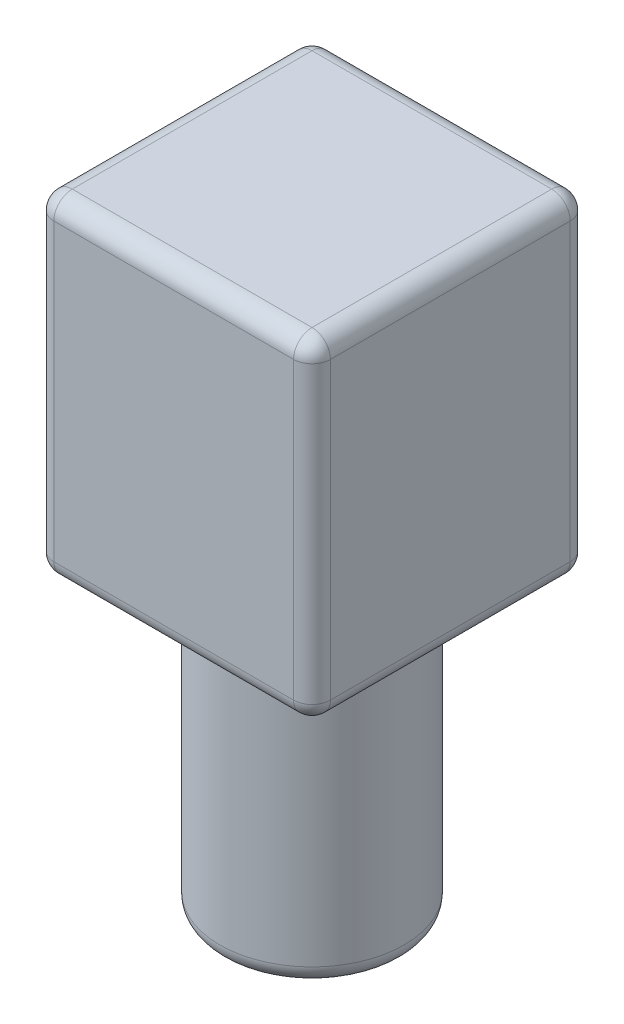
ISO-10303-21;
HEADER;
FILE_DESCRIPTION(('STEP AP214'),'2;1');
FILE_NAME('part.step','',(''),(''),'','','');
FILE_SCHEMA(('AUTOMOTIVE_DESIGN { 1 0 10303 214 1 1 1 1 }'));
ENDSEC;
DATA;
#1=APPLICATION_CONTEXT('core data for automotive mechanical design processes');
#2=APPLICATION_PROTOCOL_DEFINITION('international standard','automotive_design',2000,#1);
#3=PRODUCT_CONTEXT('',#1,'mechanical');
#4=PRODUCT('Part','Part','',(#3));
#5=PRODUCT_RELATED_PRODUCT_CATEGORY('part','',(#4));
#6=PRODUCT_DEFINITION_FORMATION('','',#4);
#7=PRODUCT_DEFINITION_CONTEXT('part definition',#1,'design');
#8=PRODUCT_DEFINITION('design','',#6,#7);
#9=PRODUCT_DEFINITION_SHAPE('','',#8);
#10=(LENGTH_UNIT() NAMED_UNIT(*) SI_UNIT(.MILLI.,.METRE.));
#11=(NAMED_UNIT(*) PLANE_ANGLE_UNIT() SI_UNIT($,.RADIAN.));
#12=(NAMED_UNIT(*) SI_UNIT($,.STERADIAN.) SOLID_ANGLE_UNIT());
#13=UNCERTAINTY_MEASURE_WITH_UNIT(LENGTH_MEASURE(1.E-05),#10,'distance_accuracy_value','');
#14=(GEOMETRIC_REPRESENTATION_CONTEXT(3) GLOBAL_UNCERTAINTY_ASSIGNED_CONTEXT((#13)) GLOBAL_UNIT_ASSIGNED_CONTEXT((#10,
#11,#12)) REPRESENTATION_CONTEXT('',''));
#15=CARTESIAN_POINT('',(0.,0.,0.));
#16=DIRECTION('',(0.,0.,1.));
#17=DIRECTION('',(1.,0.,0.));
#18=AXIS2_PLACEMENT_3D('',#15,#16,#17);
#19=CARTESIAN_POINT('',(0.,32.,0.));
#20=DIRECTION('',(0.,-1.,0.));
#21=DIRECTION('',(0.,0.,-1.));
#22=AXIS2_PLACEMENT_3D('',#19,#20,#21);
#23=CYLINDRICAL_SURFACE('',#22,10.);
#24=CARTESIAN_POINT('',(0.,2.,0.));
#25=DIRECTION('',(0.,1.,0.));
#26=DIRECTION('',(0.,0.,1.));
#27=AXIS2_PLACEMENT_3D('',#24,#25,#26);
#28=CIRCLE('',#27,10.);
#29=CARTESIAN_POINT('',(0.,2.,10.));
#30=VERTEX_POINT('',#29);
#31=EDGE_CURVE('E170',#30,#30,#28,.T.);
#32=ORIENTED_EDGE('',*,*,#31,.T.);
#33=EDGE_LOOP('',(#32));
#34=FACE_BOUND('',#33,.T.);
#35=CARTESIAN_POINT('',(0.,32.,0.));
#36=DIRECTION('',(0.,1.,0.));
#37=DIRECTION('',(0.,0.,1.));
#38=AXIS2_PLACEMENT_3D('',#35,#36,#37);
#39=CIRCLE('',#38,10.);
#40=CARTESIAN_POINT('',(0.,32.,10.));
#41=VERTEX_POINT('',#40);
#42=EDGE_CURVE('E267',#41,#41,#39,.T.);
#43=ORIENTED_EDGE('',*,*,#42,.F.);
#44=EDGE_LOOP('',(#43));
#45=FACE_BOUND('',#44,.T.);
#46=ADVANCED_FACE('F40',(#34,#45),#23,.T.);
#47=CARTESIAN_POINT('',(0.,0.,0.));
#48=DIRECTION('',(0.,1.,0.));
#49=DIRECTION('',(0.,0.,1.));
#50=AXIS2_PLACEMENT_3D('',#47,#48,#49);
#51=PLANE('',#50);
#52=CARTESIAN_POINT('',(0.,0.,0.));
#53=DIRECTION('',(0.,1.,0.));
#54=DIRECTION('',(0.,0.,1.));
#55=AXIS2_PLACEMENT_3D('',#52,#53,#54);
#56=CIRCLE('',#55,8.);
#57=CARTESIAN_POINT('',(0.,0.,8.));
#58=VERTEX_POINT('',#57);
#59=EDGE_CURVE('E167',#58,#58,#56,.F.);
#60=ORIENTED_EDGE('',*,*,#59,.T.);
#61=EDGE_LOOP('',(#60));
#62=FACE_BOUND('',#61,.T.);
#63=ADVANCED_FACE('F296',(#62),#51,.F.);
#64=CARTESIAN_POINT('',(-15.,68.,15.));
#65=DIRECTION('',(-1.,0.,0.));
#66=DIRECTION('',(0.,0.,1.));
#67=AXIS2_PLACEMENT_3D('',#64,#65,#66);
#68=PLANE('',#67);
#69=DIRECTION('',(0.,0.,-1.));
#70=VECTOR('',#69,1.);
#71=CARTESIAN_POINT('',(-15.,66.,-15.));
#72=LINE('',#71,#70);
#73=CARTESIAN_POINT('',(-15.,66.,13.));
#74=VERTEX_POINT('',#73);
#75=CARTESIAN_POINT('',(-15.,66.,-13.));
#76=VERTEX_POINT('',#75);
#77=EDGE_CURVE('E179',#74,#76,#72,.T.);
#78=ORIENTED_EDGE('',*,*,#77,.T.);
#79=DIRECTION('',(0.,-1.,0.));
#80=VECTOR('',#79,1.);
#81=CARTESIAN_POINT('',(-15.,68.,-13.));
#82=LINE('',#81,#80);
#83=CARTESIAN_POINT('',(-15.,34.,-13.));
#84=VERTEX_POINT('',#83);
#85=EDGE_CURVE('E184',#76,#84,#82,.T.);
#86=ORIENTED_EDGE('',*,*,#85,.T.);
#87=DIRECTION('',(0.,0.,-1.));
#88=VECTOR('',#87,1.);
#89=CARTESIAN_POINT('',(-15.,34.,15.));
#90=LINE('',#89,#88);
#91=CARTESIAN_POINT('',(-15.,34.,13.));
#92=VERTEX_POINT('',#91);
#93=EDGE_CURVE('E181',#84,#92,#90,.F.);
#94=ORIENTED_EDGE('',*,*,#93,.T.);
#95=DIRECTION('',(0.,-1.,0.));
#96=VECTOR('',#95,1.);
#97=CARTESIAN_POINT('',(-15.,68.,13.));
#98=LINE('',#97,#96);
#99=EDGE_CURVE('E177',#92,#74,#98,.F.);
#100=ORIENTED_EDGE('',*,*,#99,.T.);
#101=EDGE_LOOP('',(#78,#86,#94,#100));
#102=FACE_BOUND('',#101,.T.);
#103=ADVANCED_FACE('F300',(#102),#68,.T.);
#104=CARTESIAN_POINT('',(-15.,68.,15.));
#105=DIRECTION('',(0.,0.,-1.));
#106=DIRECTION('',(-1.,0.,0.));
#107=AXIS2_PLACEMENT_3D('',#104,#105,#106);
#108=PLANE('',#107);
#109=DIRECTION('',(1.,0.,0.));
#110=VECTOR('',#109,1.);
#111=CARTESIAN_POINT('',(15.,34.,15.));
#112=LINE('',#111,#110);
#113=CARTESIAN_POINT('',(-13.,34.,15.));
#114=VERTEX_POINT('',#113);
#115=CARTESIAN_POINT('',(13.,34.,15.));
#116=VERTEX_POINT('',#115);
#117=EDGE_CURVE('E206',#114,#116,#112,.T.);
#118=ORIENTED_EDGE('',*,*,#117,.T.);
#119=DIRECTION('',(0.,-1.,0.));
#120=VECTOR('',#119,1.);
#121=CARTESIAN_POINT('',(13.,68.,15.));
#122=LINE('',#121,#120);
#123=CARTESIAN_POINT('',(13.,66.,15.));
#124=VERTEX_POINT('',#123);
#125=EDGE_CURVE('E209',#116,#124,#122,.F.);
#126=ORIENTED_EDGE('',*,*,#125,.T.);
#127=DIRECTION('',(1.,0.,0.));
#128=VECTOR('',#127,1.);
#129=CARTESIAN_POINT('',(-15.,66.,15.));
#130=LINE('',#129,#128);
#131=CARTESIAN_POINT('',(-13.,66.,15.));
#132=VERTEX_POINT('',#131);
#133=EDGE_CURVE('E204',#124,#132,#130,.F.);
#134=ORIENTED_EDGE('',*,*,#133,.T.);
#135=DIRECTION('',(0.,-1.,0.));
#136=VECTOR('',#135,1.);
#137=CARTESIAN_POINT('',(-13.,32.,15.));
#138=LINE('',#137,#136);
#139=EDGE_CURVE('E202',#132,#114,#138,.T.);
#140=ORIENTED_EDGE('',*,*,#139,.T.);
#141=EDGE_LOOP('',(#118,#126,#134,#140));
#142=FACE_BOUND('',#141,.T.);
#143=ADVANCED_FACE('F306',(#142),#108,.F.);
#144=CARTESIAN_POINT('',(15.,68.,15.));
#145=DIRECTION('',(-1.,0.,0.));
#146=DIRECTION('',(0.,0.,1.));
#147=AXIS2_PLACEMENT_3D('',#144,#145,#146);
#148=PLANE('',#147);
#149=DIRECTION('',(0.,0.,-1.));
#150=VECTOR('',#149,1.);
#151=CARTESIAN_POINT('',(15.,34.,-15.));
#152=LINE('',#151,#150);
#153=CARTESIAN_POINT('',(15.,34.,13.));
#154=VERTEX_POINT('',#153);
#155=CARTESIAN_POINT('',(15.,34.,-13.));
#156=VERTEX_POINT('',#155);
#157=EDGE_CURVE('E148',#154,#156,#152,.T.);
#158=ORIENTED_EDGE('',*,*,#157,.T.);
#159=DIRECTION('',(0.,-1.,0.));
#160=VECTOR('',#159,1.);
#161=CARTESIAN_POINT('',(15.,68.,-13.));
#162=LINE('',#161,#160);
#163=CARTESIAN_POINT('',(15.,66.,-13.));
#164=VERTEX_POINT('',#163);
#165=EDGE_CURVE('E200',#156,#164,#162,.F.);
#166=ORIENTED_EDGE('',*,*,#165,.T.);
#167=DIRECTION('',(0.,0.,-1.));
#168=VECTOR('',#167,1.);
#169=CARTESIAN_POINT('',(15.,66.,15.));
#170=LINE('',#169,#168);
#171=CARTESIAN_POINT('',(15.,66.,13.));
#172=VERTEX_POINT('',#171);
#173=EDGE_CURVE('E197',#164,#172,#170,.F.);
#174=ORIENTED_EDGE('',*,*,#173,.T.);
#175=DIRECTION('',(0.,-1.,0.));
#176=VECTOR('',#175,1.);
#177=CARTESIAN_POINT('',(15.,68.,13.));
#178=LINE('',#177,#176);
#179=EDGE_CURVE('E195',#172,#154,#178,.T.);
#180=ORIENTED_EDGE('',*,*,#179,.T.);
#181=EDGE_LOOP('',(#158,#166,#174,#180));
#182=FACE_BOUND('',#181,.T.);
#183=ADVANCED_FACE('F311',(#182),#148,.F.);
#184=CARTESIAN_POINT('',(-15.,68.,-15.));
#185=DIRECTION('',(0.,0.,-1.));
#186=DIRECTION('',(-1.,0.,0.));
#187=AXIS2_PLACEMENT_3D('',#184,#185,#186);
#188=PLANE('',#187);
#189=DIRECTION('',(1.,0.,0.));
#190=VECTOR('',#189,1.);
#191=CARTESIAN_POINT('',(-15.,34.,-15.));
#192=LINE('',#191,#190);
#193=CARTESIAN_POINT('',(13.,34.,-15.));
#194=VERTEX_POINT('',#193);
#195=CARTESIAN_POINT('',(-13.,34.,-15.));
#196=VERTEX_POINT('',#195);
#197=EDGE_CURVE('E190',#194,#196,#192,.F.);
#198=ORIENTED_EDGE('',*,*,#197,.T.);
#199=DIRECTION('',(0.,-1.,0.));
#200=VECTOR('',#199,1.);
#201=CARTESIAN_POINT('',(-13.,68.,-15.));
#202=LINE('',#201,#200);
#203=CARTESIAN_POINT('',(-13.,66.,-15.));
#204=VERTEX_POINT('',#203);
#205=EDGE_CURVE('E193',#196,#204,#202,.F.);
#206=ORIENTED_EDGE('',*,*,#205,.T.);
#207=DIRECTION('',(1.,0.,0.));
#208=VECTOR('',#207,1.);
#209=CARTESIAN_POINT('',(15.,66.,-15.));
#210=LINE('',#209,#208);
#211=CARTESIAN_POINT('',(13.,66.,-15.));
#212=VERTEX_POINT('',#211);
#213=EDGE_CURVE('E188',#204,#212,#210,.T.);
#214=ORIENTED_EDGE('',*,*,#213,.T.);
#215=DIRECTION('',(0.,-1.,0.));
#216=VECTOR('',#215,1.);
#217=CARTESIAN_POINT('',(13.,32.,-15.));
#218=LINE('',#217,#216);
#219=EDGE_CURVE('E186',#212,#194,#218,.T.);
#220=ORIENTED_EDGE('',*,*,#219,.T.);
#221=EDGE_LOOP('',(#198,#206,#214,#220));
#222=FACE_BOUND('',#221,.T.);
#223=ADVANCED_FACE('F308',(#222),#188,.T.);
#224=CARTESIAN_POINT('',(0.,68.,0.));
#225=DIRECTION('',(0.,-1.,0.));
#226=DIRECTION('',(0.,0.,-1.));
#227=AXIS2_PLACEMENT_3D('',#224,#225,#226);
#228=PLANE('',#227);
#229=DIRECTION('',(1.,0.,0.));
#230=VECTOR('',#229,1.);
#231=CARTESIAN_POINT('',(-15.,68.,-13.));
#232=LINE('',#231,#230);
#233=CARTESIAN_POINT('',(13.,68.,-13.));
#234=VERTEX_POINT('',#233);
#235=CARTESIAN_POINT('',(-13.,68.,-13.));
#236=VERTEX_POINT('',#235);
#237=EDGE_CURVE('E49',#234,#236,#232,.F.);
#238=ORIENTED_EDGE('',*,*,#237,.T.);
#239=DIRECTION('',(0.,0.,-1.));
#240=VECTOR('',#239,1.);
#241=CARTESIAN_POINT('',(-13.,68.,15.));
#242=LINE('',#241,#240);
#243=CARTESIAN_POINT('',(-13.,68.,13.));
#244=VERTEX_POINT('',#243);
#245=EDGE_CURVE('E11',#236,#244,#242,.F.);
#246=ORIENTED_EDGE('',*,*,#245,.T.);
#247=DIRECTION('',(1.,0.,0.));
#248=VECTOR('',#247,1.);
#249=CARTESIAN_POINT('',(0.,68.,13.));
#250=LINE('',#249,#248);
#251=CARTESIAN_POINT('',(13.,68.,13.));
#252=VERTEX_POINT('',#251);
#253=EDGE_CURVE('E211',#244,#252,#250,.T.);
#254=ORIENTED_EDGE('',*,*,#253,.T.);
#255=DIRECTION('',(0.,0.,-1.));
#256=VECTOR('',#255,1.);
#257=CARTESIAN_POINT('',(13.,68.,0.));
#258=LINE('',#257,#256);
#259=EDGE_CURVE('E60',#252,#234,#258,.T.);
#260=ORIENTED_EDGE('',*,*,#259,.T.);
#261=EDGE_LOOP('',(#238,#246,#254,#260));
#262=FACE_BOUND('',#261,.T.);
#263=ADVANCED_FACE('F290',(#262),#228,.F.);
#264=CARTESIAN_POINT('',(0.,32.,0.));
#265=DIRECTION('',(0.,-1.,0.));
#266=DIRECTION('',(0.,0.,-1.));
#267=AXIS2_PLACEMENT_3D('',#264,#265,#266);
#268=PLANE('',#267);
#269=DIRECTION('',(1.,0.,0.));
#270=VECTOR('',#269,1.);
#271=CARTESIAN_POINT('',(-15.,32.,13.));
#272=LINE('',#271,#270);
#273=CARTESIAN_POINT('',(13.,32.,13.));
#274=VERTEX_POINT('',#273);
#275=CARTESIAN_POINT('',(-13.,32.,13.));
#276=VERTEX_POINT('',#275);
#277=EDGE_CURVE('E134',#274,#276,#272,.F.);
#278=ORIENTED_EDGE('',*,*,#277,.T.);
#279=DIRECTION('',(0.,0.,-1.));
#280=VECTOR('',#279,1.);
#281=CARTESIAN_POINT('',(-13.,32.,0.));
#282=LINE('',#281,#280);
#283=CARTESIAN_POINT('',(-13.,32.,-13.));
#284=VERTEX_POINT('',#283);
#285=EDGE_CURVE('E175',#276,#284,#282,.T.);
#286=ORIENTED_EDGE('',*,*,#285,.T.);
#287=DIRECTION('',(1.,0.,0.));
#288=VECTOR('',#287,1.);
#289=CARTESIAN_POINT('',(0.,32.,-13.));
#290=LINE('',#289,#288);
#291=CARTESIAN_POINT('',(13.,32.,-13.));
#292=VERTEX_POINT('',#291);
#293=EDGE_CURVE('E137',#284,#292,#290,.T.);
#294=ORIENTED_EDGE('',*,*,#293,.T.);
#295=DIRECTION('',(0.,0.,-1.));
#296=VECTOR('',#295,1.);
#297=CARTESIAN_POINT('',(13.,32.,15.));
#298=LINE('',#297,#296);
#299=EDGE_CURVE('E128',#292,#274,#298,.F.);
#300=ORIENTED_EDGE('',*,*,#299,.T.);
#301=EDGE_LOOP('',(#278,#286,#294,#300));
#302=FACE_BOUND('',#301,.T.);
#303=ORIENTED_EDGE('',*,*,#42,.T.);
#304=EDGE_LOOP('',(#303));
#305=FACE_BOUND('',#304,.T.);
#306=ADVANCED_FACE('F130',(#302,#305),#268,.T.);
#307=CARTESIAN_POINT('',(0.,2.,0.));
#308=DIRECTION('',(0.,1.,0.));
#309=DIRECTION('',(0.,0.,1.));
#310=AXIS2_PLACEMENT_3D('',#307,#308,#309);
#311=TOROIDAL_SURFACE('',#310,8.,2.);
#312=ORIENTED_EDGE('',*,*,#59,.F.);
#313=EDGE_LOOP('',(#312));
#314=FACE_BOUND('',#313,.T.);
#315=ORIENTED_EDGE('',*,*,#31,.F.);
#316=EDGE_LOOP('',(#315));
#317=FACE_BOUND('',#316,.T.);
#318=ADVANCED_FACE('F280',(#314,#317),#311,.T.);
#319=CARTESIAN_POINT('',(13.,66.,0.));
#320=DIRECTION('',(0.,0.,-1.));
#321=DIRECTION('',(-1.,0.,0.));
#322=AXIS2_PLACEMENT_3D('',#319,#320,#321);
#323=CYLINDRICAL_SURFACE('',#322,2.);
#324=CARTESIAN_POINT('',(13.,66.,13.));
#325=DIRECTION('',(0.,0.,1.));
#326=DIRECTION('',(1.,0.,0.));
#327=AXIS2_PLACEMENT_3D('',#324,#325,#326);
#328=CIRCLE('',#327,2.);
#329=EDGE_CURVE('E44',#172,#252,#328,.T.);
#330=ORIENTED_EDGE('',*,*,#329,.F.);
#331=ORIENTED_EDGE('',*,*,#173,.F.);
#332=CARTESIAN_POINT('',(13.,66.,-13.));
#333=DIRECTION('',(0.,0.,-1.));
#334=DIRECTION('',(-1.,0.,0.));
#335=AXIS2_PLACEMENT_3D('',#332,#333,#334);
#336=CIRCLE('',#335,2.);
#337=EDGE_CURVE('E261',#234,#164,#336,.T.);
#338=ORIENTED_EDGE('',*,*,#337,.F.);
#339=ORIENTED_EDGE('',*,*,#259,.F.);
#340=EDGE_LOOP('',(#330,#331,#338,#339));
#341=FACE_BOUND('',#340,.T.);
#342=ADVANCED_FACE('F42',(#341),#323,.T.);
#343=CARTESIAN_POINT('',(13.,66.,13.));
#344=DIRECTION('',(0.,1.,0.));
#345=DIRECTION('',(0.,0.,1.));
#346=AXIS2_PLACEMENT_3D('',#343,#344,#345);
#347=SPHERICAL_SURFACE('',#346,2.);
#348=CARTESIAN_POINT('',(13.,66.,13.));
#349=DIRECTION('',(0.,1.,0.));
#350=DIRECTION('',(0.,0.,1.));
#351=AXIS2_PLACEMENT_3D('',#348,#349,#350);
#352=CIRCLE('',#351,2.);
#353=EDGE_CURVE('E256',#172,#124,#352,.F.);
#354=ORIENTED_EDGE('',*,*,#353,.F.);
#355=ORIENTED_EDGE('',*,*,#329,.T.);
#356=CARTESIAN_POINT('',(13.,66.,13.));
#357=DIRECTION('',(1.,0.,0.));
#358=DIRECTION('',(0.,0.,-1.));
#359=AXIS2_PLACEMENT_3D('',#356,#357,#358);
#360=CIRCLE('',#359,2.);
#361=EDGE_CURVE('E259',#124,#252,#360,.F.);
#362=ORIENTED_EDGE('',*,*,#361,.F.);
#363=EDGE_LOOP('',(#354,#355,#362));
#364=FACE_BOUND('',#363,.T.);
#365=ADVANCED_FACE('F288',(#364),#347,.T.);
#366=CARTESIAN_POINT('',(13.,66.,-13.));
#367=DIRECTION('',(1.,0.,0.));
#368=DIRECTION('',(0.,0.,-1.));
#369=AXIS2_PLACEMENT_3D('',#366,#367,#368);
#370=SPHERICAL_SURFACE('',#369,2.);
#371=CARTESIAN_POINT('',(13.,66.,-13.));
#372=DIRECTION('',(1.,0.,0.));
#373=DIRECTION('',(0.,1.,0.));
#374=AXIS2_PLACEMENT_3D('',#371,#372,#373);
#375=CIRCLE('',#374,2.);
#376=EDGE_CURVE('E250',#234,#212,#375,.F.);
#377=ORIENTED_EDGE('',*,*,#376,.F.);
#378=ORIENTED_EDGE('',*,*,#337,.T.);
#379=CARTESIAN_POINT('',(13.,66.,-13.));
#380=DIRECTION('',(0.,1.,0.));
#381=DIRECTION('',(0.,0.,1.));
#382=AXIS2_PLACEMENT_3D('',#379,#380,#381);
#383=CIRCLE('',#382,2.);
#384=EDGE_CURVE('E253',#212,#164,#383,.F.);
#385=ORIENTED_EDGE('',*,*,#384,.F.);
#386=EDGE_LOOP('',(#377,#378,#385));
#387=FACE_BOUND('',#386,.T.);
#388=ADVANCED_FACE('F349',(#387),#370,.T.);
#389=CARTESIAN_POINT('',(0.,66.,13.));
#390=DIRECTION('',(1.,0.,0.));
#391=DIRECTION('',(0.,0.,-1.));
#392=AXIS2_PLACEMENT_3D('',#389,#390,#391);
#393=CYLINDRICAL_SURFACE('',#392,2.);
#394=ORIENTED_EDGE('',*,*,#361,.T.);
#395=ORIENTED_EDGE('',*,*,#253,.F.);
#396=CARTESIAN_POINT('',(-13.,66.,13.));
#397=DIRECTION('',(-1.,0.,0.));
#398=DIRECTION('',(0.,0.,1.));
#399=AXIS2_PLACEMENT_3D('',#396,#397,#398);
#400=CIRCLE('',#399,2.);
#401=EDGE_CURVE('E245',#132,#244,#400,.T.);
#402=ORIENTED_EDGE('',*,*,#401,.F.);
#403=ORIENTED_EDGE('',*,*,#133,.F.);
#404=EDGE_LOOP('',(#394,#395,#402,#403));
#405=FACE_BOUND('',#404,.T.);
#406=ADVANCED_FACE('F357',(#405),#393,.T.);
#407=CARTESIAN_POINT('',(13.,68.,13.));
#408=DIRECTION('',(0.,-1.,0.));
#409=DIRECTION('',(0.,0.,-1.));
#410=AXIS2_PLACEMENT_3D('',#407,#408,#409);
#411=CYLINDRICAL_SURFACE('',#410,2.);
#412=ORIENTED_EDGE('',*,*,#353,.T.);
#413=ORIENTED_EDGE('',*,*,#125,.F.);
#414=CARTESIAN_POINT('',(13.,34.,13.));
#415=DIRECTION('',(0.,-1.,0.));
#416=DIRECTION('',(0.,0.,-1.));
#417=AXIS2_PLACEMENT_3D('',#414,#415,#416);
#418=CIRCLE('',#417,2.);
#419=EDGE_CURVE('E152',#154,#116,#418,.T.);
#420=ORIENTED_EDGE('',*,*,#419,.F.);
#421=ORIENTED_EDGE('',*,*,#179,.F.);
#422=EDGE_LOOP('',(#412,#413,#420,#421));
#423=FACE_BOUND('',#422,.T.);
#424=ADVANCED_FACE('F366',(#423),#411,.T.);
#425=CARTESIAN_POINT('',(13.,34.,15.));
#426=DIRECTION('',(0.,0.,1.));
#427=DIRECTION('',(1.,0.,0.));
#428=AXIS2_PLACEMENT_3D('',#425,#426,#427);
#429=CYLINDRICAL_SURFACE('',#428,2.);
#430=CARTESIAN_POINT('',(13.,34.,-13.));
#431=DIRECTION('',(0.,0.,-1.));
#432=DIRECTION('',(-1.,0.,0.));
#433=AXIS2_PLACEMENT_3D('',#430,#431,#432);
#434=CIRCLE('',#433,2.);
#435=EDGE_CURVE('E153',#156,#292,#434,.T.);
#436=ORIENTED_EDGE('',*,*,#435,.F.);
#437=ORIENTED_EDGE('',*,*,#157,.F.);
#438=CARTESIAN_POINT('',(13.,34.,13.));
#439=DIRECTION('',(0.,0.,1.));
#440=DIRECTION('',(1.,0.,0.));
#441=AXIS2_PLACEMENT_3D('',#438,#439,#440);
#442=CIRCLE('',#441,2.);
#443=EDGE_CURVE('E144',#274,#154,#442,.T.);
#444=ORIENTED_EDGE('',*,*,#443,.F.);
#445=ORIENTED_EDGE('',*,*,#299,.F.);
#446=EDGE_LOOP('',(#436,#437,#444,#445));
#447=FACE_BOUND('',#446,.T.);
#448=ADVANCED_FACE('F146',(#447),#429,.T.);
#449=CARTESIAN_POINT('',(13.,68.,-13.));
#450=DIRECTION('',(0.,1.,0.));
#451=DIRECTION('',(0.,0.,1.));
#452=AXIS2_PLACEMENT_3D('',#449,#450,#451);
#453=CYLINDRICAL_SURFACE('',#452,2.);
#454=ORIENTED_EDGE('',*,*,#384,.T.);
#455=ORIENTED_EDGE('',*,*,#165,.F.);
#456=CARTESIAN_POINT('',(13.,34.,-13.));
#457=DIRECTION('',(0.,-1.,0.));
#458=DIRECTION('',(0.,0.,-1.));
#459=AXIS2_PLACEMENT_3D('',#456,#457,#458);
#460=CIRCLE('',#459,2.);
#461=EDGE_CURVE('E241',#194,#156,#460,.T.);
#462=ORIENTED_EDGE('',*,*,#461,.F.);
#463=ORIENTED_EDGE('',*,*,#219,.F.);
#464=EDGE_LOOP('',(#454,#455,#462,#463));
#465=FACE_BOUND('',#464,.T.);
#466=ADVANCED_FACE('F385',(#465),#453,.T.);
#467=CARTESIAN_POINT('',(-15.,66.,-13.));
#468=DIRECTION('',(-1.,0.,0.));
#469=DIRECTION('',(0.,0.,1.));
#470=AXIS2_PLACEMENT_3D('',#467,#468,#469);
#471=CYLINDRICAL_SURFACE('',#470,2.);
#472=ORIENTED_EDGE('',*,*,#376,.T.);
#473=ORIENTED_EDGE('',*,*,#213,.F.);
#474=CARTESIAN_POINT('',(-13.,66.,-13.));
#475=DIRECTION('',(-1.,0.,0.));
#476=DIRECTION('',(0.,0.,1.));
#477=AXIS2_PLACEMENT_3D('',#474,#475,#476);
#478=CIRCLE('',#477,2.);
#479=EDGE_CURVE('E238',#236,#204,#478,.T.);
#480=ORIENTED_EDGE('',*,*,#479,.F.);
#481=ORIENTED_EDGE('',*,*,#237,.F.);
#482=EDGE_LOOP('',(#472,#473,#480,#481));
#483=FACE_BOUND('',#482,.T.);
#484=ADVANCED_FACE('F394',(#483),#471,.T.);
#485=CARTESIAN_POINT('',(-13.,66.,15.));
#486=DIRECTION('',(0.,0.,1.));
#487=DIRECTION('',(1.,0.,0.));
#488=AXIS2_PLACEMENT_3D('',#485,#486,#487);
#489=CYLINDRICAL_SURFACE('',#488,2.);
#490=CARTESIAN_POINT('',(-13.,66.,13.));
#491=DIRECTION('',(0.,0.,1.));
#492=DIRECTION('',(1.,0.,0.));
#493=AXIS2_PLACEMENT_3D('',#490,#491,#492);
#494=CIRCLE('',#493,2.);
#495=EDGE_CURVE('E247',#244,#74,#494,.T.);
#496=ORIENTED_EDGE('',*,*,#495,.F.);
#497=ORIENTED_EDGE('',*,*,#245,.F.);
#498=CARTESIAN_POINT('',(-13.,66.,-13.));
#499=DIRECTION('',(0.,0.,-1.));
#500=DIRECTION('',(0.,1.,0.));
#501=AXIS2_PLACEMENT_3D('',#498,#499,#500);
#502=CIRCLE('',#501,2.);
#503=EDGE_CURVE('E235',#76,#236,#502,.T.);
#504=ORIENTED_EDGE('',*,*,#503,.F.);
#505=ORIENTED_EDGE('',*,*,#77,.F.);
#506=EDGE_LOOP('',(#496,#497,#504,#505));
#507=FACE_BOUND('',#506,.T.);
#508=ADVANCED_FACE('F404',(#507),#489,.T.);
#509=CARTESIAN_POINT('',(-13.,66.,13.));
#510=DIRECTION('',(0.,1.,0.));
#511=DIRECTION('',(0.,0.,1.));
#512=AXIS2_PLACEMENT_3D('',#509,#510,#511);
#513=SPHERICAL_SURFACE('',#512,2.);
#514=ORIENTED_EDGE('',*,*,#401,.T.);
#515=ORIENTED_EDGE('',*,*,#495,.T.);
#516=CARTESIAN_POINT('',(-13.,66.,13.));
#517=DIRECTION('',(0.,1.,0.));
#518=DIRECTION('',(0.,0.,1.));
#519=AXIS2_PLACEMENT_3D('',#516,#517,#518);
#520=CIRCLE('',#519,2.);
#521=EDGE_CURVE('E160',#132,#74,#520,.F.);
#522=ORIENTED_EDGE('',*,*,#521,.F.);
#523=EDGE_LOOP('',(#514,#515,#522));
#524=FACE_BOUND('',#523,.T.);
#525=ADVANCED_FACE('F414',(#524),#513,.T.);
#526=CARTESIAN_POINT('',(13.,34.,13.));
#527=DIRECTION('',(1.,0.,0.));
#528=DIRECTION('',(0.,0.,-1.));
#529=AXIS2_PLACEMENT_3D('',#526,#527,#528);
#530=SPHERICAL_SURFACE('',#529,2.);
#531=ORIENTED_EDGE('',*,*,#443,.T.);
#532=ORIENTED_EDGE('',*,*,#419,.T.);
#533=CARTESIAN_POINT('',(13.,34.,13.));
#534=DIRECTION('',(1.,0.,0.));
#535=DIRECTION('',(0.,0.,-1.));
#536=AXIS2_PLACEMENT_3D('',#533,#534,#535);
#537=CIRCLE('',#536,2.);
#538=EDGE_CURVE('E155',#274,#116,#537,.F.);
#539=ORIENTED_EDGE('',*,*,#538,.F.);
#540=EDGE_LOOP('',(#531,#532,#539));
#541=FACE_BOUND('',#540,.T.);
#542=ADVANCED_FACE('F156',(#541),#530,.T.);
#543=CARTESIAN_POINT('',(13.,34.,-13.));
#544=DIRECTION('',(1.,0.,0.));
#545=DIRECTION('',(0.,0.,-1.));
#546=AXIS2_PLACEMENT_3D('',#543,#544,#545);
#547=SPHERICAL_SURFACE('',#546,2.);
#548=ORIENTED_EDGE('',*,*,#461,.T.);
#549=ORIENTED_EDGE('',*,*,#435,.T.);
#550=CARTESIAN_POINT('',(13.,34.,-13.));
#551=DIRECTION('',(1.,0.,0.));
#552=DIRECTION('',(0.,0.,-1.));
#553=AXIS2_PLACEMENT_3D('',#550,#551,#552);
#554=CIRCLE('',#553,2.);
#555=EDGE_CURVE('E161',#194,#292,#554,.F.);
#556=ORIENTED_EDGE('',*,*,#555,.F.);
#557=EDGE_LOOP('',(#548,#549,#556));
#558=FACE_BOUND('',#557,.T.);
#559=ADVANCED_FACE('F433',(#558),#547,.T.);
#560=CARTESIAN_POINT('',(-13.,66.,-13.));
#561=DIRECTION('',(0.,1.,0.));
#562=DIRECTION('',(0.,0.,1.));
#563=AXIS2_PLACEMENT_3D('',#560,#561,#562);
#564=SPHERICAL_SURFACE('',#563,2.);
#565=ORIENTED_EDGE('',*,*,#503,.T.);
#566=ORIENTED_EDGE('',*,*,#479,.T.);
#567=CARTESIAN_POINT('',(-13.,66.,-13.));
#568=DIRECTION('',(0.,1.,0.));
#569=DIRECTION('',(0.,0.,1.));
#570=AXIS2_PLACEMENT_3D('',#567,#568,#569);
#571=CIRCLE('',#570,2.);
#572=EDGE_CURVE('E228',#76,#204,#571,.F.);
#573=ORIENTED_EDGE('',*,*,#572,.F.);
#574=EDGE_LOOP('',(#565,#566,#573));
#575=FACE_BOUND('',#574,.T.);
#576=ADVANCED_FACE('F442',(#575),#564,.T.);
#577=CARTESIAN_POINT('',(-13.,68.,13.));
#578=DIRECTION('',(0.,1.,0.));
#579=DIRECTION('',(0.,0.,1.));
#580=AXIS2_PLACEMENT_3D('',#577,#578,#579);
#581=CYLINDRICAL_SURFACE('',#580,2.);
#582=ORIENTED_EDGE('',*,*,#521,.T.);
#583=ORIENTED_EDGE('',*,*,#99,.F.);
#584=CARTESIAN_POINT('',(-13.,34.,13.));
#585=DIRECTION('',(0.,-1.,0.));
#586=DIRECTION('',(0.,0.,-1.));
#587=AXIS2_PLACEMENT_3D('',#584,#585,#586);
#588=CIRCLE('',#587,2.);
#589=EDGE_CURVE('E225',#114,#92,#588,.T.);
#590=ORIENTED_EDGE('',*,*,#589,.F.);
#591=ORIENTED_EDGE('',*,*,#139,.F.);
#592=EDGE_LOOP('',(#582,#583,#590,#591));
#593=FACE_BOUND('',#592,.T.);
#594=ADVANCED_FACE('F452',(#593),#581,.T.);
#595=CARTESIAN_POINT('',(-15.,34.,13.));
#596=DIRECTION('',(-1.,0.,0.));
#597=DIRECTION('',(0.,0.,1.));
#598=AXIS2_PLACEMENT_3D('',#595,#596,#597);
#599=CYLINDRICAL_SURFACE('',#598,2.);
#600=ORIENTED_EDGE('',*,*,#538,.T.);
#601=ORIENTED_EDGE('',*,*,#117,.F.);
#602=CARTESIAN_POINT('',(-13.,34.,13.));
#603=DIRECTION('',(-1.,0.,0.));
#604=DIRECTION('',(0.,0.,1.));
#605=AXIS2_PLACEMENT_3D('',#602,#603,#604);
#606=CIRCLE('',#605,2.);
#607=EDGE_CURVE('E165',#276,#114,#606,.T.);
#608=ORIENTED_EDGE('',*,*,#607,.F.);
#609=ORIENTED_EDGE('',*,*,#277,.F.);
#610=EDGE_LOOP('',(#600,#601,#608,#609));
#611=FACE_BOUND('',#610,.T.);
#612=ADVANCED_FACE('F163',(#611),#599,.T.);
#613=CARTESIAN_POINT('',(0.,34.,-13.));
#614=DIRECTION('',(1.,0.,0.));
#615=DIRECTION('',(0.,0.,-1.));
#616=AXIS2_PLACEMENT_3D('',#613,#614,#615);
#617=CYLINDRICAL_SURFACE('',#616,2.);
#618=ORIENTED_EDGE('',*,*,#555,.T.);
#619=ORIENTED_EDGE('',*,*,#293,.F.);
#620=CARTESIAN_POINT('',(-13.,34.,-13.));
#621=DIRECTION('',(-1.,0.,0.));
#622=DIRECTION('',(0.,0.,1.));
#623=AXIS2_PLACEMENT_3D('',#620,#621,#622);
#624=CIRCLE('',#623,2.);
#625=EDGE_CURVE('E221',#196,#284,#624,.T.);
#626=ORIENTED_EDGE('',*,*,#625,.F.);
#627=ORIENTED_EDGE('',*,*,#197,.F.);
#628=EDGE_LOOP('',(#618,#619,#626,#627));
#629=FACE_BOUND('',#628,.T.);
#630=ADVANCED_FACE('F471',(#629),#617,.T.);
#631=CARTESIAN_POINT('',(-13.,68.,-13.));
#632=DIRECTION('',(0.,-1.,0.));
#633=DIRECTION('',(0.,0.,-1.));
#634=AXIS2_PLACEMENT_3D('',#631,#632,#633);
#635=CYLINDRICAL_SURFACE('',#634,2.);
#636=ORIENTED_EDGE('',*,*,#572,.T.);
#637=ORIENTED_EDGE('',*,*,#205,.F.);
#638=CARTESIAN_POINT('',(-13.,34.,-13.));
#639=DIRECTION('',(0.,-1.,0.));
#640=DIRECTION('',(0.,0.,-1.));
#641=AXIS2_PLACEMENT_3D('',#638,#639,#640);
#642=CIRCLE('',#641,2.);
#643=EDGE_CURVE('E219',#84,#196,#642,.T.);
#644=ORIENTED_EDGE('',*,*,#643,.F.);
#645=ORIENTED_EDGE('',*,*,#85,.F.);
#646=EDGE_LOOP('',(#636,#637,#644,#645));
#647=FACE_BOUND('',#646,.T.);
#648=ADVANCED_FACE('F480',(#647),#635,.T.);
#649=CARTESIAN_POINT('',(-13.,34.,13.));
#650=DIRECTION('',(0.,0.,1.));
#651=DIRECTION('',(1.,0.,0.));
#652=AXIS2_PLACEMENT_3D('',#649,#650,#651);
#653=SPHERICAL_SURFACE('',#652,2.);
#654=ORIENTED_EDGE('',*,*,#607,.T.);
#655=ORIENTED_EDGE('',*,*,#589,.T.);
#656=CARTESIAN_POINT('',(-13.,34.,13.));
#657=DIRECTION('',(0.,0.,1.));
#658=DIRECTION('',(1.,0.,0.));
#659=AXIS2_PLACEMENT_3D('',#656,#657,#658);
#660=CIRCLE('',#659,2.);
#661=EDGE_CURVE('E217',#276,#92,#660,.F.);
#662=ORIENTED_EDGE('',*,*,#661,.F.);
#663=EDGE_LOOP('',(#654,#655,#662));
#664=FACE_BOUND('',#663,.T.);
#665=ADVANCED_FACE('F490',(#664),#653,.T.);
#666=CARTESIAN_POINT('',(-13.,34.,-13.));
#667=DIRECTION('',(0.,0.,-1.));
#668=DIRECTION('',(-1.,0.,0.));
#669=AXIS2_PLACEMENT_3D('',#666,#667,#668);
#670=SPHERICAL_SURFACE('',#669,2.);
#671=ORIENTED_EDGE('',*,*,#643,.T.);
#672=ORIENTED_EDGE('',*,*,#625,.T.);
#673=CARTESIAN_POINT('',(-13.,34.,-13.));
#674=DIRECTION('',(0.,0.,-1.));
#675=DIRECTION('',(-1.,0.,0.));
#676=AXIS2_PLACEMENT_3D('',#673,#674,#675);
#677=CIRCLE('',#676,2.);
#678=EDGE_CURVE('E215',#84,#284,#677,.F.);
#679=ORIENTED_EDGE('',*,*,#678,.F.);
#680=EDGE_LOOP('',(#671,#672,#679));
#681=FACE_BOUND('',#680,.T.);
#682=ADVANCED_FACE('F500',(#681),#670,.T.);
#683=CARTESIAN_POINT('',(-13.,34.,0.));
#684=DIRECTION('',(0.,0.,-1.));
#685=DIRECTION('',(-1.,0.,0.));
#686=AXIS2_PLACEMENT_3D('',#683,#684,#685);
#687=CYLINDRICAL_SURFACE('',#686,2.);
#688=ORIENTED_EDGE('',*,*,#661,.T.);
#689=ORIENTED_EDGE('',*,*,#93,.F.);
#690=ORIENTED_EDGE('',*,*,#678,.T.);
#691=ORIENTED_EDGE('',*,*,#285,.F.);
#692=EDGE_LOOP('',(#688,#689,#690,#691));
#693=FACE_BOUND('',#692,.T.);
#694=ADVANCED_FACE('F510',(#693),#687,.T.);
#695=CLOSED_SHELL('',(#46,#63,#103,#143,#183,#223,#263,#306,#318,#342,#365,#388,#406,#424,#448,
#466,#484,#508,#525,#542,#559,#576,#594,#612,#630,#648,#665,#682,#694));
#696=MANIFOLD_SOLID_BREP('B2',#695);
#697=ADVANCED_BREP_SHAPE_REPRESENTATION('',(#18,#696),#14);
#698=SHAPE_DEFINITION_REPRESENTATION(#9,#697);
ENDSEC;
END-ISO-10303-21;
